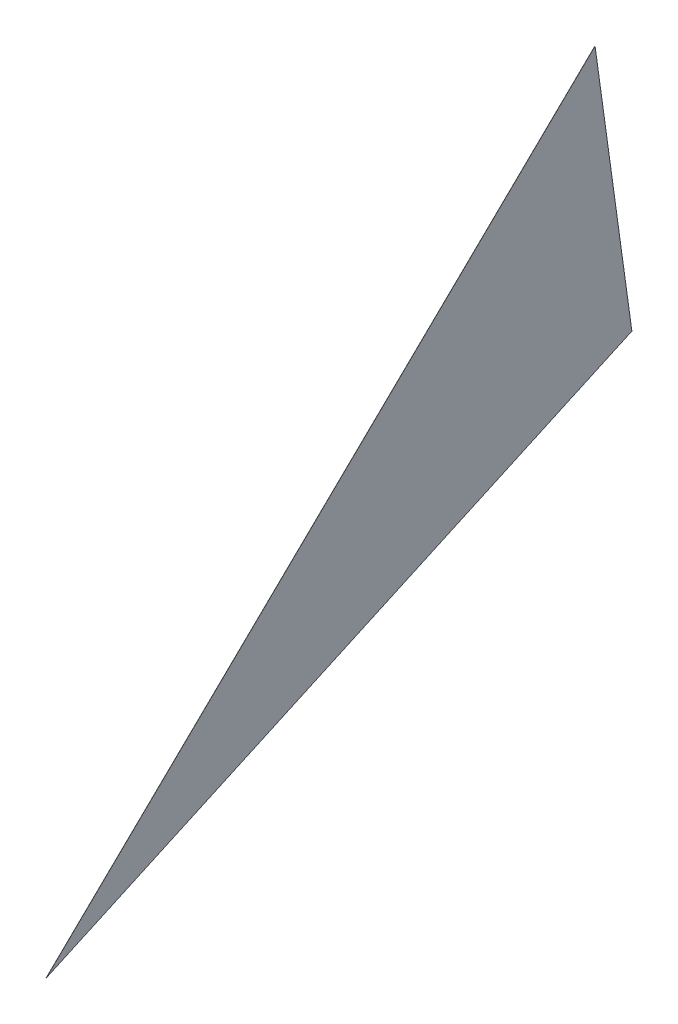
ISO-10303-21;
HEADER;
FILE_DESCRIPTION(('STEP AP214'),'2;1');
FILE_NAME('part.step','',(''),(''),'','','');
FILE_SCHEMA(('AUTOMOTIVE_DESIGN { 1 0 10303 214 1 1 1 1 }'));
ENDSEC;
DATA;
#1=APPLICATION_CONTEXT('core data for automotive mechanical design processes');
#2=APPLICATION_PROTOCOL_DEFINITION('international standard','automotive_design',2000,#1);
#3=PRODUCT_CONTEXT('',#1,'mechanical');
#4=PRODUCT('Part','Part','',(#3));
#5=PRODUCT_RELATED_PRODUCT_CATEGORY('part','',(#4));
#6=PRODUCT_DEFINITION_FORMATION('','',#4);
#7=PRODUCT_DEFINITION_CONTEXT('part definition',#1,'design');
#8=PRODUCT_DEFINITION('design','',#6,#7);
#9=PRODUCT_DEFINITION_SHAPE('','',#8);
#10=(LENGTH_UNIT() NAMED_UNIT(*) SI_UNIT(.MILLI.,.METRE.));
#11=(NAMED_UNIT(*) PLANE_ANGLE_UNIT() SI_UNIT($,.RADIAN.));
#12=(NAMED_UNIT(*) SI_UNIT($,.STERADIAN.) SOLID_ANGLE_UNIT());
#13=UNCERTAINTY_MEASURE_WITH_UNIT(LENGTH_MEASURE(1.E-05),#10,'distance_accuracy_value','');
#14=(GEOMETRIC_REPRESENTATION_CONTEXT(3) GLOBAL_UNCERTAINTY_ASSIGNED_CONTEXT((#13)) GLOBAL_UNIT_ASSIGNED_CONTEXT((#10,
#11,#12)) REPRESENTATION_CONTEXT('',''));
#15=CARTESIAN_POINT('',(0.,0.,0.));
#16=DIRECTION('',(0.,0.,1.));
#17=DIRECTION('',(1.,0.,0.));
#18=AXIS2_PLACEMENT_3D('',#15,#16,#17);
#19=CARTESIAN_POINT('',(0.0254,105.082258037668,-108.264890069242));
#20=DIRECTION('',(0.,-0.717575294077534,-0.696480938238471));
#21=DIRECTION('',(0.,0.696480938238471,-0.717575294077534));
#22=AXIS2_PLACEMENT_3D('',#19,#20,#21);
#23=PLANE('',#22);
#24=DIRECTION('',(0.,-0.696480938238471,0.717575294077534));
#25=VECTOR('',#24,1.);
#26=CARTESIAN_POINT('',(0.,105.082258037668,-108.264890069242));
#27=LINE('',#26,#25);
#28=CARTESIAN_POINT('',(0.,105.082258037668,-108.264890069242));
#29=VERTEX_POINT('',#28);
#30=CARTESIAN_POINT('',(0.,0.,0.));
#31=VERTEX_POINT('',#30);
#32=EDGE_CURVE('E89',#29,#31,#27,.T.);
#33=ORIENTED_EDGE('',*,*,#32,.T.);
#34=DIRECTION('',(-1.,0.,0.));
#35=VECTOR('',#34,1.);
#36=CARTESIAN_POINT('',(0.0254,0.,0.));
#37=LINE('',#36,#35);
#38=CARTESIAN_POINT('',(0.0254,0.,0.));
#39=VERTEX_POINT('',#38);
#40=EDGE_CURVE('E11',#39,#31,#37,.T.);
#41=ORIENTED_EDGE('',*,*,#40,.F.);
#42=DIRECTION('',(0.,-0.696480938238471,0.717575294077534));
#43=VECTOR('',#42,1.);
#44=CARTESIAN_POINT('',(0.0254,105.082258037668,-108.264890069242));
#45=LINE('',#44,#43);
#46=CARTESIAN_POINT('',(0.0254,105.082258037668,-108.264890069242));
#47=VERTEX_POINT('',#46);
#48=EDGE_CURVE('E81',#47,#39,#45,.T.);
#49=ORIENTED_EDGE('',*,*,#48,.F.);
#50=DIRECTION('',(-1.,0.,0.));
#51=VECTOR('',#50,1.);
#52=CARTESIAN_POINT('',(0.0254,105.082258037668,-108.264890069242));
#53=LINE('',#52,#51);
#54=EDGE_CURVE('E90',#47,#29,#53,.T.);
#55=ORIENTED_EDGE('',*,*,#54,.T.);
#56=EDGE_LOOP('',(#33,#41,#49,#55));
#57=FACE_BOUND('',#56,.T.);
#58=ADVANCED_FACE('F39',(#57),#23,.F.);
#59=CARTESIAN_POINT('',(0.0254,0.,0.));
#60=DIRECTION('',(0.,0.909653887737676,0.415367072026336));
#61=DIRECTION('',(0.,-0.415367072026336,0.909653887737676));
#62=AXIS2_PLACEMENT_3D('',#59,#60,#61);
#63=PLANE('',#62);
#64=DIRECTION('',(0.,0.415367072026336,-0.909653887737676));
#65=VECTOR('',#64,1.);
#66=CARTESIAN_POINT('',(0.,0.,0.));
#67=LINE('',#66,#65);
#68=CARTESIAN_POINT('',(0.,52.7516181473447,-115.526043742685));
#69=VERTEX_POINT('',#68);
#70=EDGE_CURVE('E68',#31,#69,#67,.T.);
#71=ORIENTED_EDGE('',*,*,#70,.T.);
#72=DIRECTION('',(-1.,0.,0.));
#73=VECTOR('',#72,1.);
#74=CARTESIAN_POINT('',(0.0254,52.7516181473447,-115.526043742685));
#75=LINE('',#74,#73);
#76=CARTESIAN_POINT('',(0.0254,52.7516181473447,-115.526043742685));
#77=VERTEX_POINT('',#76);
#78=EDGE_CURVE('E48',#77,#69,#75,.T.);
#79=ORIENTED_EDGE('',*,*,#78,.F.);
#80=DIRECTION('',(0.,0.415367072026336,-0.909653887737676));
#81=VECTOR('',#80,1.);
#82=CARTESIAN_POINT('',(0.0254,0.,0.));
#83=LINE('',#82,#81);
#84=EDGE_CURVE('E76',#39,#77,#83,.T.);
#85=ORIENTED_EDGE('',*,*,#84,.F.);
#86=ORIENTED_EDGE('',*,*,#40,.T.);
#87=EDGE_LOOP('',(#71,#79,#85,#86));
#88=FACE_BOUND('',#87,.T.);
#89=ADVANCED_FACE('F77',(#88),#63,.F.);
#90=CARTESIAN_POINT('',(0.0254,52.7516181473447,-115.526043742685));
#91=DIRECTION('',(0.,-0.13743855378261,0.990510294713863));
#92=DIRECTION('',(0.,-0.990510294713864,-0.13743855378261));
#93=AXIS2_PLACEMENT_3D('',#90,#91,#92);
#94=PLANE('',#93);
#95=DIRECTION('',(0.,0.990510294713863,0.13743855378261));
#96=VECTOR('',#95,1.);
#97=CARTESIAN_POINT('',(0.,52.7516181473447,-115.526043742685));
#98=LINE('',#97,#96);
#99=EDGE_CURVE('E73',#69,#29,#98,.T.);
#100=ORIENTED_EDGE('',*,*,#99,.T.);
#101=ORIENTED_EDGE('',*,*,#54,.F.);
#102=DIRECTION('',(0.,0.990510294713863,0.13743855378261));
#103=VECTOR('',#102,1.);
#104=CARTESIAN_POINT('',(0.0254,52.7516181473447,-115.526043742685));
#105=LINE('',#104,#103);
#106=EDGE_CURVE('E56',#77,#47,#105,.T.);
#107=ORIENTED_EDGE('',*,*,#106,.F.);
#108=ORIENTED_EDGE('',*,*,#78,.T.);
#109=EDGE_LOOP('',(#100,#101,#107,#108));
#110=FACE_BOUND('',#109,.T.);
#111=ADVANCED_FACE('F102',(#110),#94,.F.);
#112=CARTESIAN_POINT('',(0.0254,0.,0.));
#113=DIRECTION('',(-1.,0.,0.));
#114=DIRECTION('',(0.,0.,1.));
#115=AXIS2_PLACEMENT_3D('',#112,#113,#114);
#116=PLANE('',#115);
#117=ORIENTED_EDGE('',*,*,#48,.T.);
#118=ORIENTED_EDGE('',*,*,#84,.T.);
#119=ORIENTED_EDGE('',*,*,#106,.T.);
#120=EDGE_LOOP('',(#117,#118,#119));
#121=FACE_BOUND('',#120,.T.);
#122=ADVANCED_FACE('F84',(#121),#116,.F.);
#123=CARTESIAN_POINT('',(0.,0.,0.));
#124=DIRECTION('',(-1.,0.,0.));
#125=DIRECTION('',(0.,0.,1.));
#126=AXIS2_PLACEMENT_3D('',#123,#124,#125);
#127=PLANE('',#126);
#128=ORIENTED_EDGE('',*,*,#32,.F.);
#129=ORIENTED_EDGE('',*,*,#99,.F.);
#130=ORIENTED_EDGE('',*,*,#70,.F.);
#131=EDGE_LOOP('',(#128,#129,#130));
#132=FACE_BOUND('',#131,.T.);
#133=ADVANCED_FACE('F103',(#132),#127,.T.);
#134=CLOSED_SHELL('',(#58,#89,#111,#122,#133));
#135=MANIFOLD_SOLID_BREP('B2',#134);
#136=ADVANCED_BREP_SHAPE_REPRESENTATION('',(#18,#135),#14);
#137=SHAPE_DEFINITION_REPRESENTATION(#9,#136);
ENDSEC;
END-ISO-10303-21;
